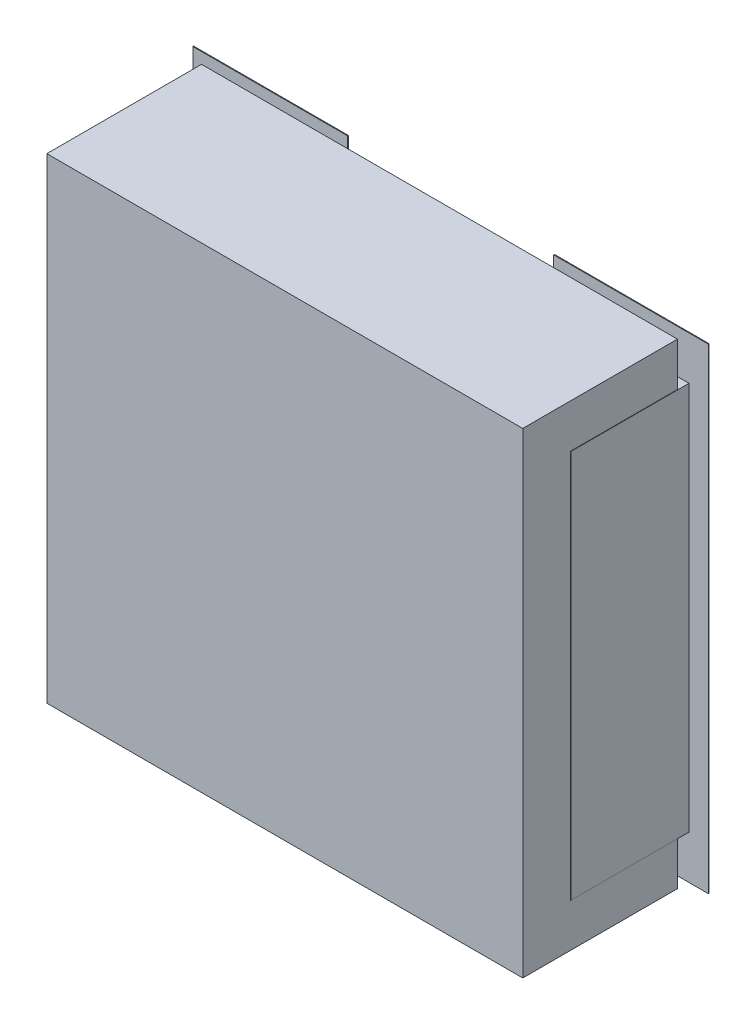
ISO-10303-21;
HEADER;
FILE_DESCRIPTION(('STEP AP214'),'2;1');
FILE_NAME('part.step','',(''),(''),'','','');
FILE_SCHEMA(('AUTOMOTIVE_DESIGN { 1 0 10303 214 1 1 1 1 }'));
ENDSEC;
DATA;
#1=APPLICATION_CONTEXT('core data for automotive mechanical design processes');
#2=APPLICATION_PROTOCOL_DEFINITION('international standard','automotive_design',2000,#1);
#3=PRODUCT_CONTEXT('',#1,'mechanical');
#4=PRODUCT('Part','Part','',(#3));
#5=PRODUCT_RELATED_PRODUCT_CATEGORY('part','',(#4));
#6=PRODUCT_DEFINITION_FORMATION('','',#4);
#7=PRODUCT_DEFINITION_CONTEXT('part definition',#1,'design');
#8=PRODUCT_DEFINITION('design','',#6,#7);
#9=PRODUCT_DEFINITION_SHAPE('','',#8);
#10=(LENGTH_UNIT() NAMED_UNIT(*) SI_UNIT(.MILLI.,.METRE.));
#11=(NAMED_UNIT(*) PLANE_ANGLE_UNIT() SI_UNIT($,.RADIAN.));
#12=(NAMED_UNIT(*) SI_UNIT($,.STERADIAN.) SOLID_ANGLE_UNIT());
#13=UNCERTAINTY_MEASURE_WITH_UNIT(LENGTH_MEASURE(1.E-05),#10,'distance_accuracy_value','');
#14=(GEOMETRIC_REPRESENTATION_CONTEXT(3) GLOBAL_UNCERTAINTY_ASSIGNED_CONTEXT((#13)) GLOBAL_UNIT_ASSIGNED_CONTEXT((#10,
#11,#12)) REPRESENTATION_CONTEXT('',''));
#15=CARTESIAN_POINT('',(0.,0.,0.));
#16=DIRECTION('',(0.,0.,1.));
#17=DIRECTION('',(1.,0.,0.));
#18=AXIS2_PLACEMENT_3D('',#15,#16,#17);
#19=CARTESIAN_POINT('',(0.,0.,0.0762));
#20=DIRECTION('',(0.,0.,1.));
#21=DIRECTION('',(1.,0.,0.));
#22=AXIS2_PLACEMENT_3D('',#19,#20,#21);
#23=PLANE('',#22);
#24=DIRECTION('',(0.,1.,0.));
#25=VECTOR('',#24,1.);
#26=CARTESIAN_POINT('',(1.3,3.,0.0762));
#27=LINE('',#26,#25);
#28=CARTESIAN_POINT('',(1.3,3.,0.0762));
#29=VERTEX_POINT('',#28);
#30=CARTESIAN_POINT('',(1.3,-3.,0.0762));
#31=VERTEX_POINT('',#30);
#32=EDGE_CURVE('E176',#29,#31,#27,.F.);
#33=ORIENTED_EDGE('',*,*,#32,.F.);
#34=DIRECTION('',(1.,0.,0.));
#35=VECTOR('',#34,1.);
#36=CARTESIAN_POINT('',(3.25,3.,0.0762));
#37=LINE('',#36,#35);
#38=CARTESIAN_POINT('',(3.25,3.,0.0762));
#39=VERTEX_POINT('',#38);
#40=EDGE_CURVE('E20',#39,#29,#37,.F.);
#41=ORIENTED_EDGE('',*,*,#40,.F.);
#42=DIRECTION('',(0.,1.,0.));
#43=VECTOR('',#42,1.);
#44=CARTESIAN_POINT('',(3.25,-3.,0.0762));
#45=LINE('',#44,#43);
#46=CARTESIAN_POINT('',(3.25,-3.,0.0762));
#47=VERTEX_POINT('',#46);
#48=EDGE_CURVE('E204',#47,#39,#45,.T.);
#49=ORIENTED_EDGE('',*,*,#48,.F.);
#50=DIRECTION('',(1.,0.,0.));
#51=VECTOR('',#50,1.);
#52=CARTESIAN_POINT('',(1.3,-3.,0.0762));
#53=LINE('',#52,#51);
#54=EDGE_CURVE('E189',#31,#47,#53,.T.);
#55=ORIENTED_EDGE('',*,*,#54,.F.);
#56=EDGE_LOOP('',(#33,#41,#49,#55));
#57=FACE_BOUND('',#56,.T.);
#58=ADVANCED_FACE('F17',(#57),#23,.F.);
#59=CARTESIAN_POINT('',(0.,0.,0.0762));
#60=DIRECTION('',(0.,0.,1.));
#61=DIRECTION('',(1.,0.,0.));
#62=AXIS2_PLACEMENT_3D('',#59,#60,#61);
#63=PLANE('',#62);
#64=DIRECTION('',(0.,1.,0.));
#65=VECTOR('',#64,1.);
#66=CARTESIAN_POINT('',(-1.3,-3.,0.0762));
#67=LINE('',#66,#65);
#68=CARTESIAN_POINT('',(-1.3,-3.,0.0762));
#69=VERTEX_POINT('',#68);
#70=CARTESIAN_POINT('',(-1.3,3.,0.0762));
#71=VERTEX_POINT('',#70);
#72=EDGE_CURVE('E211',#69,#71,#67,.T.);
#73=ORIENTED_EDGE('',*,*,#72,.F.);
#74=DIRECTION('',(1.,0.,0.));
#75=VECTOR('',#74,1.);
#76=CARTESIAN_POINT('',(-3.25,-3.,0.0762));
#77=LINE('',#76,#75);
#78=CARTESIAN_POINT('',(-3.25,-3.,0.0762));
#79=VERTEX_POINT('',#78);
#80=EDGE_CURVE('E206',#79,#69,#77,.T.);
#81=ORIENTED_EDGE('',*,*,#80,.F.);
#82=DIRECTION('',(0.,1.,0.));
#83=VECTOR('',#82,1.);
#84=CARTESIAN_POINT('',(-3.25,3.,0.0762));
#85=LINE('',#84,#83);
#86=CARTESIAN_POINT('',(-3.25,3.,0.0762));
#87=VERTEX_POINT('',#86);
#88=EDGE_CURVE('E224',#87,#79,#85,.F.);
#89=ORIENTED_EDGE('',*,*,#88,.F.);
#90=DIRECTION('',(1.,0.,0.));
#91=VECTOR('',#90,1.);
#92=CARTESIAN_POINT('',(-1.3,3.,0.0762));
#93=LINE('',#92,#91);
#94=EDGE_CURVE('E216',#71,#87,#93,.F.);
#95=ORIENTED_EDGE('',*,*,#94,.F.);
#96=EDGE_LOOP('',(#73,#81,#89,#95));
#97=FACE_BOUND('',#96,.T.);
#98=ADVANCED_FACE('F492',(#97),#63,.F.);
#99=CARTESIAN_POINT('',(3.25,3.,0.0762));
#100=DIRECTION('',(0.,1.,0.));
#101=DIRECTION('',(0.,0.,1.));
#102=AXIS2_PLACEMENT_3D('',#99,#100,#101);
#103=PLANE('',#102);
#104=DIRECTION('',(0.,0.,-1.));
#105=VECTOR('',#104,1.);
#106=CARTESIAN_POINT('',(3.25,3.,0.0762));
#107=LINE('',#106,#105);
#108=CARTESIAN_POINT('',(3.25,3.,0.0862));
#109=VERTEX_POINT('',#108);
#110=EDGE_CURVE('E185',#39,#109,#107,.F.);
#111=ORIENTED_EDGE('',*,*,#110,.F.);
#112=ORIENTED_EDGE('',*,*,#40,.T.);
#113=DIRECTION('',(0.,0.,1.));
#114=VECTOR('',#113,1.);
#115=CARTESIAN_POINT('',(1.3,3.,0.0762));
#116=LINE('',#115,#114);
#117=CARTESIAN_POINT('',(1.3,3.,0.0862));
#118=VERTEX_POINT('',#117);
#119=EDGE_CURVE('E182',#118,#29,#116,.F.);
#120=ORIENTED_EDGE('',*,*,#119,.F.);
#121=DIRECTION('',(1.,0.,0.));
#122=VECTOR('',#121,1.);
#123=CARTESIAN_POINT('',(0.,3.,0.0862));
#124=LINE('',#123,#122);
#125=EDGE_CURVE('E227',#109,#118,#124,.F.);
#126=ORIENTED_EDGE('',*,*,#125,.F.);
#127=EDGE_LOOP('',(#111,#112,#120,#126));
#128=FACE_BOUND('',#127,.T.);
#129=ADVANCED_FACE('F181',(#128),#103,.T.);
#130=CARTESIAN_POINT('',(1.3,3.,0.0762));
#131=DIRECTION('',(-1.,0.,0.));
#132=DIRECTION('',(0.,0.,1.));
#133=AXIS2_PLACEMENT_3D('',#130,#131,#132);
#134=PLANE('',#133);
#135=ORIENTED_EDGE('',*,*,#119,.T.);
#136=ORIENTED_EDGE('',*,*,#32,.T.);
#137=DIRECTION('',(0.,0.,-1.));
#138=VECTOR('',#137,1.);
#139=CARTESIAN_POINT('',(1.3,-3.,0.0762));
#140=LINE('',#139,#138);
#141=CARTESIAN_POINT('',(1.3,-3.,0.0862));
#142=VERTEX_POINT('',#141);
#143=EDGE_CURVE('E191',#142,#31,#140,.T.);
#144=ORIENTED_EDGE('',*,*,#143,.F.);
#145=DIRECTION('',(0.,1.,0.));
#146=VECTOR('',#145,1.);
#147=CARTESIAN_POINT('',(1.3,0.,0.0862));
#148=LINE('',#147,#146);
#149=EDGE_CURVE('E195',#118,#142,#148,.F.);
#150=ORIENTED_EDGE('',*,*,#149,.F.);
#151=EDGE_LOOP('',(#135,#136,#144,#150));
#152=FACE_BOUND('',#151,.T.);
#153=ADVANCED_FACE('F193',(#152),#134,.T.);
#154=CARTESIAN_POINT('',(1.3,-3.,0.0762));
#155=DIRECTION('',(0.,-1.,0.));
#156=DIRECTION('',(0.,0.,-1.));
#157=AXIS2_PLACEMENT_3D('',#154,#155,#156);
#158=PLANE('',#157);
#159=ORIENTED_EDGE('',*,*,#143,.T.);
#160=ORIENTED_EDGE('',*,*,#54,.T.);
#161=DIRECTION('',(0.,0.,-1.));
#162=VECTOR('',#161,1.);
#163=CARTESIAN_POINT('',(3.25,-3.,0.0762));
#164=LINE('',#163,#162);
#165=CARTESIAN_POINT('',(3.25,-3.,0.0862));
#166=VERTEX_POINT('',#165);
#167=EDGE_CURVE('E201',#166,#47,#164,.T.);
#168=ORIENTED_EDGE('',*,*,#167,.F.);
#169=DIRECTION('',(1.,0.,0.));
#170=VECTOR('',#169,1.);
#171=CARTESIAN_POINT('',(0.,-3.,0.0862));
#172=LINE('',#171,#170);
#173=EDGE_CURVE('E230',#142,#166,#172,.T.);
#174=ORIENTED_EDGE('',*,*,#173,.F.);
#175=EDGE_LOOP('',(#159,#160,#168,#174));
#176=FACE_BOUND('',#175,.T.);
#177=ADVANCED_FACE('F502',(#176),#158,.T.);
#178=CARTESIAN_POINT('',(3.25,-3.,0.0762));
#179=DIRECTION('',(1.,0.,0.));
#180=DIRECTION('',(0.,0.,-1.));
#181=AXIS2_PLACEMENT_3D('',#178,#179,#180);
#182=PLANE('',#181);
#183=ORIENTED_EDGE('',*,*,#167,.T.);
#184=ORIENTED_EDGE('',*,*,#48,.T.);
#185=ORIENTED_EDGE('',*,*,#110,.T.);
#186=DIRECTION('',(0.,1.,0.));
#187=VECTOR('',#186,1.);
#188=CARTESIAN_POINT('',(3.25,0.,0.0862));
#189=LINE('',#188,#187);
#190=EDGE_CURVE('E233',#166,#109,#189,.T.);
#191=ORIENTED_EDGE('',*,*,#190,.F.);
#192=EDGE_LOOP('',(#183,#184,#185,#191));
#193=FACE_BOUND('',#192,.T.);
#194=ADVANCED_FACE('F505',(#193),#182,.T.);
#195=CARTESIAN_POINT('',(-3.25,-3.,0.0762));
#196=DIRECTION('',(0.,-1.,0.));
#197=DIRECTION('',(0.,0.,-1.));
#198=AXIS2_PLACEMENT_3D('',#195,#196,#197);
#199=PLANE('',#198);
#200=DIRECTION('',(0.,0.,1.));
#201=VECTOR('',#200,1.);
#202=CARTESIAN_POINT('',(-3.25,-3.,0.0762));
#203=LINE('',#202,#201);
#204=CARTESIAN_POINT('',(-3.25,-3.,0.0862));
#205=VERTEX_POINT('',#204);
#206=EDGE_CURVE('E218',#79,#205,#203,.T.);
#207=ORIENTED_EDGE('',*,*,#206,.F.);
#208=ORIENTED_EDGE('',*,*,#80,.T.);
#209=DIRECTION('',(0.,0.,-1.));
#210=VECTOR('',#209,1.);
#211=CARTESIAN_POINT('',(-1.3,-3.,0.0762));
#212=LINE('',#211,#210);
#213=CARTESIAN_POINT('',(-1.3,-3.,0.0862));
#214=VERTEX_POINT('',#213);
#215=EDGE_CURVE('E208',#214,#69,#212,.T.);
#216=ORIENTED_EDGE('',*,*,#215,.F.);
#217=DIRECTION('',(1.,0.,0.));
#218=VECTOR('',#217,1.);
#219=CARTESIAN_POINT('',(0.,-3.,0.0862));
#220=LINE('',#219,#218);
#221=EDGE_CURVE('E240',#205,#214,#220,.T.);
#222=ORIENTED_EDGE('',*,*,#221,.F.);
#223=EDGE_LOOP('',(#207,#208,#216,#222));
#224=FACE_BOUND('',#223,.T.);
#225=ADVANCED_FACE('F487',(#224),#199,.T.);
#226=CARTESIAN_POINT('',(-1.3,-3.,0.0762));
#227=DIRECTION('',(1.,0.,0.));
#228=DIRECTION('',(0.,0.,-1.));
#229=AXIS2_PLACEMENT_3D('',#226,#227,#228);
#230=PLANE('',#229);
#231=ORIENTED_EDGE('',*,*,#215,.T.);
#232=ORIENTED_EDGE('',*,*,#72,.T.);
#233=DIRECTION('',(0.,0.,1.));
#234=VECTOR('',#233,1.);
#235=CARTESIAN_POINT('',(-1.3,3.,0.0762));
#236=LINE('',#235,#234);
#237=CARTESIAN_POINT('',(-1.3,3.,0.0862));
#238=VERTEX_POINT('',#237);
#239=EDGE_CURVE('E213',#238,#71,#236,.F.);
#240=ORIENTED_EDGE('',*,*,#239,.F.);
#241=DIRECTION('',(0.,1.,0.));
#242=VECTOR('',#241,1.);
#243=CARTESIAN_POINT('',(-1.3,0.,0.0862));
#244=LINE('',#243,#242);
#245=EDGE_CURVE('E243',#214,#238,#244,.T.);
#246=ORIENTED_EDGE('',*,*,#245,.F.);
#247=EDGE_LOOP('',(#231,#232,#240,#246));
#248=FACE_BOUND('',#247,.T.);
#249=ADVANCED_FACE('F490',(#248),#230,.T.);
#250=CARTESIAN_POINT('',(-1.3,3.,0.0762));
#251=DIRECTION('',(0.,1.,0.));
#252=DIRECTION('',(0.,0.,1.));
#253=AXIS2_PLACEMENT_3D('',#250,#251,#252);
#254=PLANE('',#253);
#255=ORIENTED_EDGE('',*,*,#239,.T.);
#256=ORIENTED_EDGE('',*,*,#94,.T.);
#257=DIRECTION('',(0.,0.,1.));
#258=VECTOR('',#257,1.);
#259=CARTESIAN_POINT('',(-3.25,3.,0.0762));
#260=LINE('',#259,#258);
#261=CARTESIAN_POINT('',(-3.25,3.,0.0862));
#262=VERTEX_POINT('',#261);
#263=EDGE_CURVE('E221',#262,#87,#260,.F.);
#264=ORIENTED_EDGE('',*,*,#263,.F.);
#265=DIRECTION('',(1.,0.,0.));
#266=VECTOR('',#265,1.);
#267=CARTESIAN_POINT('',(0.,3.,0.0862));
#268=LINE('',#267,#266);
#269=EDGE_CURVE('E246',#238,#262,#268,.F.);
#270=ORIENTED_EDGE('',*,*,#269,.F.);
#271=EDGE_LOOP('',(#255,#256,#264,#270));
#272=FACE_BOUND('',#271,.T.);
#273=ADVANCED_FACE('F480',(#272),#254,.T.);
#274=CARTESIAN_POINT('',(-3.25,3.,0.0762));
#275=DIRECTION('',(-1.,0.,0.));
#276=DIRECTION('',(0.,0.,1.));
#277=AXIS2_PLACEMENT_3D('',#274,#275,#276);
#278=PLANE('',#277);
#279=ORIENTED_EDGE('',*,*,#263,.T.);
#280=ORIENTED_EDGE('',*,*,#88,.T.);
#281=ORIENTED_EDGE('',*,*,#206,.T.);
#282=DIRECTION('',(0.,1.,0.));
#283=VECTOR('',#282,1.);
#284=CARTESIAN_POINT('',(-3.25,0.,0.0862));
#285=LINE('',#284,#283);
#286=EDGE_CURVE('E249',#262,#205,#285,.F.);
#287=ORIENTED_EDGE('',*,*,#286,.F.);
#288=EDGE_LOOP('',(#279,#280,#281,#287));
#289=FACE_BOUND('',#288,.T.);
#290=ADVANCED_FACE('F484',(#289),#278,.T.);
#291=CARTESIAN_POINT('',(0.,0.,0.0862));
#292=DIRECTION('',(0.,0.,1.));
#293=DIRECTION('',(1.,0.,0.));
#294=AXIS2_PLACEMENT_3D('',#291,#292,#293);
#295=PLANE('',#294);
#296=DIRECTION('',(0.,1.,0.));
#297=VECTOR('',#296,1.);
#298=CARTESIAN_POINT('',(1.455,2.45,0.0862));
#299=LINE('',#298,#297);
#300=CARTESIAN_POINT('',(1.455,2.45,0.0862));
#301=VERTEX_POINT('',#300);
#302=CARTESIAN_POINT('',(1.455,-2.45,0.0862));
#303=VERTEX_POINT('',#302);
#304=EDGE_CURVE('E260',#301,#303,#299,.F.);
#305=ORIENTED_EDGE('',*,*,#304,.F.);
#306=DIRECTION('',(1.,0.,0.));
#307=VECTOR('',#306,1.);
#308=CARTESIAN_POINT('',(0.,2.45,0.0862));
#309=LINE('',#308,#307);
#310=CARTESIAN_POINT('',(3.005,2.45,0.0862));
#311=VERTEX_POINT('',#310);
#312=EDGE_CURVE('E238',#301,#311,#309,.T.);
#313=ORIENTED_EDGE('',*,*,#312,.T.);
#314=DIRECTION('',(0.,1.,0.));
#315=VECTOR('',#314,1.);
#316=CARTESIAN_POINT('',(3.005,-2.45,0.0862));
#317=LINE('',#316,#315);
#318=CARTESIAN_POINT('',(3.005,-2.45,0.0862));
#319=VERTEX_POINT('',#318);
#320=EDGE_CURVE('E257',#319,#311,#317,.T.);
#321=ORIENTED_EDGE('',*,*,#320,.F.);
#322=DIRECTION('',(1.,0.,0.));
#323=VECTOR('',#322,1.);
#324=CARTESIAN_POINT('',(0.,-2.45,0.0862));
#325=LINE('',#324,#323);
#326=EDGE_CURVE('E236',#319,#303,#325,.F.);
#327=ORIENTED_EDGE('',*,*,#326,.T.);
#328=EDGE_LOOP('',(#305,#313,#321,#327));
#329=FACE_BOUND('',#328,.T.);
#330=ORIENTED_EDGE('',*,*,#173,.T.);
#331=ORIENTED_EDGE('',*,*,#190,.T.);
#332=ORIENTED_EDGE('',*,*,#125,.T.);
#333=ORIENTED_EDGE('',*,*,#149,.T.);
#334=EDGE_LOOP('',(#330,#331,#332,#333));
#335=FACE_BOUND('',#334,.T.);
#336=ADVANCED_FACE('F410',(#329,#335),#295,.T.);
#337=CARTESIAN_POINT('',(0.,0.,0.0862));
#338=DIRECTION('',(0.,0.,1.));
#339=DIRECTION('',(1.,0.,0.));
#340=AXIS2_PLACEMENT_3D('',#337,#338,#339);
#341=PLANE('',#340);
#342=DIRECTION('',(1.,0.,0.));
#343=VECTOR('',#342,1.);
#344=CARTESIAN_POINT('',(0.,-2.45,0.0862));
#345=LINE('',#344,#343);
#346=CARTESIAN_POINT('',(-1.455,-2.45,0.0862));
#347=VERTEX_POINT('',#346);
#348=CARTESIAN_POINT('',(-3.005,-2.45,0.0862));
#349=VERTEX_POINT('',#348);
#350=EDGE_CURVE('E255',#347,#349,#345,.F.);
#351=ORIENTED_EDGE('',*,*,#350,.T.);
#352=DIRECTION('',(0.,1.,0.));
#353=VECTOR('',#352,1.);
#354=CARTESIAN_POINT('',(-3.005,2.45,0.0862));
#355=LINE('',#354,#353);
#356=CARTESIAN_POINT('',(-3.005,2.45,0.0862));
#357=VERTEX_POINT('',#356);
#358=EDGE_CURVE('E271',#357,#349,#355,.F.);
#359=ORIENTED_EDGE('',*,*,#358,.F.);
#360=DIRECTION('',(1.,0.,0.));
#361=VECTOR('',#360,1.);
#362=CARTESIAN_POINT('',(0.,2.45,0.0862));
#363=LINE('',#362,#361);
#364=CARTESIAN_POINT('',(-1.455,2.45,0.0862));
#365=VERTEX_POINT('',#364);
#366=EDGE_CURVE('E252',#357,#365,#363,.T.);
#367=ORIENTED_EDGE('',*,*,#366,.T.);
#368=DIRECTION('',(0.,1.,0.));
#369=VECTOR('',#368,1.);
#370=CARTESIAN_POINT('',(-1.455,-2.45,0.0862));
#371=LINE('',#370,#369);
#372=EDGE_CURVE('E268',#347,#365,#371,.T.);
#373=ORIENTED_EDGE('',*,*,#372,.F.);
#374=EDGE_LOOP('',(#351,#359,#367,#373));
#375=FACE_BOUND('',#374,.T.);
#376=ORIENTED_EDGE('',*,*,#269,.T.);
#377=ORIENTED_EDGE('',*,*,#286,.T.);
#378=ORIENTED_EDGE('',*,*,#221,.T.);
#379=ORIENTED_EDGE('',*,*,#245,.T.);
#380=EDGE_LOOP('',(#376,#377,#378,#379));
#381=FACE_BOUND('',#380,.T.);
#382=ADVANCED_FACE('F415',(#375,#381),#341,.T.);
#383=CARTESIAN_POINT('',(3.005,-2.45,0.0762));
#384=DIRECTION('',(1.,0.,0.));
#385=DIRECTION('',(0.,0.,-1.));
#386=AXIS2_PLACEMENT_3D('',#383,#384,#385);
#387=PLANE('',#386);
#388=DIRECTION('',(0.,0.,-1.));
#389=VECTOR('',#388,1.);
#390=CARTESIAN_POINT('',(3.005,-2.45,0.0762));
#391=LINE('',#390,#389);
#392=CARTESIAN_POINT('',(3.005,-2.45,1.5762));
#393=VERTEX_POINT('',#392);
#394=EDGE_CURVE('E280',#319,#393,#391,.F.);
#395=ORIENTED_EDGE('',*,*,#394,.F.);
#396=ORIENTED_EDGE('',*,*,#320,.T.);
#397=DIRECTION('',(0.,0.,1.));
#398=VECTOR('',#397,1.);
#399=CARTESIAN_POINT('',(3.005,2.45,0.0762));
#400=LINE('',#399,#398);
#401=CARTESIAN_POINT('',(3.005,2.45,1.5762));
#402=VERTEX_POINT('',#401);
#403=EDGE_CURVE('E277',#402,#311,#400,.F.);
#404=ORIENTED_EDGE('',*,*,#403,.F.);
#405=DIRECTION('',(0.,1.,0.));
#406=VECTOR('',#405,1.);
#407=CARTESIAN_POINT('',(3.005,0.,1.5762));
#408=LINE('',#407,#406);
#409=EDGE_CURVE('E288',#393,#402,#408,.T.);
#410=ORIENTED_EDGE('',*,*,#409,.F.);
#411=EDGE_LOOP('',(#395,#396,#404,#410));
#412=FACE_BOUND('',#411,.T.);
#413=ADVANCED_FACE('F413',(#412),#387,.T.);
#414=CARTESIAN_POINT('',(1.455,2.45,0.0762));
#415=DIRECTION('',(-1.,0.,0.));
#416=DIRECTION('',(0.,0.,1.));
#417=AXIS2_PLACEMENT_3D('',#414,#415,#416);
#418=PLANE('',#417);
#419=DIRECTION('',(0.,0.,1.));
#420=VECTOR('',#419,1.);
#421=CARTESIAN_POINT('',(1.455,2.45,0.0762));
#422=LINE('',#421,#420);
#423=CARTESIAN_POINT('',(1.455,2.45,0.2262));
#424=VERTEX_POINT('',#423);
#425=EDGE_CURVE('E274',#301,#424,#422,.T.);
#426=ORIENTED_EDGE('',*,*,#425,.F.);
#427=ORIENTED_EDGE('',*,*,#304,.T.);
#428=DIRECTION('',(0.,0.,-1.));
#429=VECTOR('',#428,1.);
#430=CARTESIAN_POINT('',(1.455,-2.45,0.0762));
#431=LINE('',#430,#429);
#432=CARTESIAN_POINT('',(1.455,-2.45,0.2262));
#433=VERTEX_POINT('',#432);
#434=EDGE_CURVE('E282',#433,#303,#431,.T.);
#435=ORIENTED_EDGE('',*,*,#434,.F.);
#436=DIRECTION('',(0.,1.,0.));
#437=VECTOR('',#436,1.);
#438=CARTESIAN_POINT('',(1.455,0.,0.2262));
#439=LINE('',#438,#437);
#440=EDGE_CURVE('E294',#424,#433,#439,.F.);
#441=ORIENTED_EDGE('',*,*,#440,.F.);
#442=EDGE_LOOP('',(#426,#427,#435,#441));
#443=FACE_BOUND('',#442,.T.);
#444=ADVANCED_FACE('F407',(#443),#418,.T.);
#445=CARTESIAN_POINT('',(-1.455,-2.45,0.0762));
#446=DIRECTION('',(1.,0.,0.));
#447=DIRECTION('',(0.,0.,-1.));
#448=AXIS2_PLACEMENT_3D('',#445,#446,#447);
#449=PLANE('',#448);
#450=DIRECTION('',(0.,0.,-1.));
#451=VECTOR('',#450,1.);
#452=CARTESIAN_POINT('',(-1.455,-2.45,0.0762));
#453=LINE('',#452,#451);
#454=CARTESIAN_POINT('',(-1.455,-2.45,0.2262));
#455=VERTEX_POINT('',#454);
#456=EDGE_CURVE('E265',#455,#347,#453,.T.);
#457=ORIENTED_EDGE('',*,*,#456,.T.);
#458=ORIENTED_EDGE('',*,*,#372,.T.);
#459=DIRECTION('',(0.,0.,-1.));
#460=VECTOR('',#459,1.);
#461=CARTESIAN_POINT('',(-1.455,2.45,0.0762));
#462=LINE('',#461,#460);
#463=CARTESIAN_POINT('',(-1.455,2.45,0.2262));
#464=VERTEX_POINT('',#463);
#465=EDGE_CURVE('E263',#365,#464,#462,.F.);
#466=ORIENTED_EDGE('',*,*,#465,.T.);
#467=DIRECTION('',(0.,1.,0.));
#468=VECTOR('',#467,1.);
#469=CARTESIAN_POINT('',(-1.455,0.,0.2262));
#470=LINE('',#469,#468);
#471=EDGE_CURVE('E301',#455,#464,#470,.T.);
#472=ORIENTED_EDGE('',*,*,#471,.F.);
#473=EDGE_LOOP('',(#457,#458,#466,#472));
#474=FACE_BOUND('',#473,.T.);
#475=ADVANCED_FACE('F422',(#474),#449,.T.);
#476=CARTESIAN_POINT('',(-3.005,2.45,0.0762));
#477=DIRECTION('',(-1.,0.,0.));
#478=DIRECTION('',(0.,0.,1.));
#479=AXIS2_PLACEMENT_3D('',#476,#477,#478);
#480=PLANE('',#479);
#481=DIRECTION('',(0.,0.,1.));
#482=VECTOR('',#481,1.);
#483=CARTESIAN_POINT('',(-3.005,2.45,0.0762));
#484=LINE('',#483,#482);
#485=CARTESIAN_POINT('',(-3.005,2.45,1.5762));
#486=VERTEX_POINT('',#485);
#487=EDGE_CURVE('E315',#357,#486,#484,.T.);
#488=ORIENTED_EDGE('',*,*,#487,.F.);
#489=ORIENTED_EDGE('',*,*,#358,.T.);
#490=DIRECTION('',(0.,0.,-1.));
#491=VECTOR('',#490,1.);
#492=CARTESIAN_POINT('',(-3.005,-2.45,0.0762));
#493=LINE('',#492,#491);
#494=CARTESIAN_POINT('',(-3.005,-2.45,1.5762));
#495=VERTEX_POINT('',#494);
#496=EDGE_CURVE('E312',#495,#349,#493,.T.);
#497=ORIENTED_EDGE('',*,*,#496,.F.);
#498=DIRECTION('',(0.,1.,0.));
#499=VECTOR('',#498,1.);
#500=CARTESIAN_POINT('',(-3.005,0.,1.5762));
#501=LINE('',#500,#499);
#502=EDGE_CURVE('E323',#486,#495,#501,.F.);
#503=ORIENTED_EDGE('',*,*,#502,.F.);
#504=EDGE_LOOP('',(#488,#489,#497,#503));
#505=FACE_BOUND('',#504,.T.);
#506=ADVANCED_FACE('F459',(#505),#480,.T.);
#507=CARTESIAN_POINT('',(3.005,2.45,0.0762));
#508=DIRECTION('',(0.,1.,0.));
#509=DIRECTION('',(0.,0.,1.));
#510=AXIS2_PLACEMENT_3D('',#507,#508,#509);
#511=PLANE('',#510);
#512=ORIENTED_EDGE('',*,*,#403,.T.);
#513=ORIENTED_EDGE('',*,*,#312,.F.);
#514=ORIENTED_EDGE('',*,*,#425,.T.);
#515=DIRECTION('',(-1.,0.,0.));
#516=VECTOR('',#515,1.);
#517=CARTESIAN_POINT('',(0.,2.45,0.2262));
#518=LINE('',#517,#516);
#519=CARTESIAN_POINT('',(3.,2.45,0.2262));
#520=VERTEX_POINT('',#519);
#521=EDGE_CURVE('E306',#520,#424,#518,.T.);
#522=ORIENTED_EDGE('',*,*,#521,.F.);
#523=DIRECTION('',(0.,0.,-1.));
#524=VECTOR('',#523,1.);
#525=CARTESIAN_POINT('',(3.,2.45,0.0762));
#526=LINE('',#525,#524);
#527=CARTESIAN_POINT('',(3.,2.45,1.5762));
#528=VERTEX_POINT('',#527);
#529=EDGE_CURVE('E331',#528,#520,#526,.T.);
#530=ORIENTED_EDGE('',*,*,#529,.F.);
#531=DIRECTION('',(1.,0.,0.));
#532=VECTOR('',#531,1.);
#533=CARTESIAN_POINT('',(0.,2.45,1.5762));
#534=LINE('',#533,#532);
#535=EDGE_CURVE('E291',#402,#528,#534,.F.);
#536=ORIENTED_EDGE('',*,*,#535,.F.);
#537=EDGE_LOOP('',(#512,#513,#514,#522,#530,#536));
#538=FACE_BOUND('',#537,.T.);
#539=ADVANCED_FACE('F403',(#538),#511,.T.);
#540=CARTESIAN_POINT('',(1.455,-2.45,0.0762));
#541=DIRECTION('',(0.,-1.,0.));
#542=DIRECTION('',(0.,0.,-1.));
#543=AXIS2_PLACEMENT_3D('',#540,#541,#542);
#544=PLANE('',#543);
#545=ORIENTED_EDGE('',*,*,#434,.T.);
#546=ORIENTED_EDGE('',*,*,#326,.F.);
#547=ORIENTED_EDGE('',*,*,#394,.T.);
#548=DIRECTION('',(1.,0.,0.));
#549=VECTOR('',#548,1.);
#550=CARTESIAN_POINT('',(0.,-2.45,1.5762));
#551=LINE('',#550,#549);
#552=CARTESIAN_POINT('',(3.,-2.45,1.5762));
#553=VERTEX_POINT('',#552);
#554=EDGE_CURVE('E285',#553,#393,#551,.T.);
#555=ORIENTED_EDGE('',*,*,#554,.F.);
#556=DIRECTION('',(0.,0.,-1.));
#557=VECTOR('',#556,1.);
#558=CARTESIAN_POINT('',(3.,-2.45,0.0762));
#559=LINE('',#558,#557);
#560=CARTESIAN_POINT('',(3.,-2.45,0.2262));
#561=VERTEX_POINT('',#560);
#562=EDGE_CURVE('E342',#561,#553,#559,.F.);
#563=ORIENTED_EDGE('',*,*,#562,.F.);
#564=DIRECTION('',(-1.,0.,0.));
#565=VECTOR('',#564,1.);
#566=CARTESIAN_POINT('',(0.,-2.45,0.2262));
#567=LINE('',#566,#565);
#568=EDGE_CURVE('E297',#433,#561,#567,.F.);
#569=ORIENTED_EDGE('',*,*,#568,.F.);
#570=EDGE_LOOP('',(#545,#546,#547,#555,#563,#569));
#571=FACE_BOUND('',#570,.T.);
#572=ADVANCED_FACE('F395',(#571),#544,.T.);
#573=CARTESIAN_POINT('',(0.,0.,1.5762));
#574=DIRECTION('',(0.,0.,1.));
#575=DIRECTION('',(1.,0.,0.));
#576=AXIS2_PLACEMENT_3D('',#573,#574,#575);
#577=PLANE('',#576);
#578=ORIENTED_EDGE('',*,*,#535,.T.);
#579=DIRECTION('',(0.,1.,0.));
#580=VECTOR('',#579,1.);
#581=CARTESIAN_POINT('',(3.,-3.,1.5762));
#582=LINE('',#581,#580);
#583=EDGE_CURVE('E345',#553,#528,#582,.T.);
#584=ORIENTED_EDGE('',*,*,#583,.F.);
#585=ORIENTED_EDGE('',*,*,#554,.T.);
#586=ORIENTED_EDGE('',*,*,#409,.T.);
#587=EDGE_LOOP('',(#578,#584,#585,#586));
#588=FACE_BOUND('',#587,.T.);
#589=ADVANCED_FACE('F400',(#588),#577,.T.);
#590=CARTESIAN_POINT('',(0.,0.,0.2262));
#591=DIRECTION('',(0.,0.,-1.));
#592=DIRECTION('',(-1.,0.,0.));
#593=AXIS2_PLACEMENT_3D('',#590,#591,#592);
#594=PLANE('',#593);
#595=DIRECTION('',(0.,1.,0.));
#596=VECTOR('',#595,1.);
#597=CARTESIAN_POINT('',(3.,-3.,0.2262));
#598=LINE('',#597,#596);
#599=CARTESIAN_POINT('',(3.,3.,0.2262));
#600=VERTEX_POINT('',#599);
#601=EDGE_CURVE('E334',#520,#600,#598,.T.);
#602=ORIENTED_EDGE('',*,*,#601,.F.);
#603=ORIENTED_EDGE('',*,*,#521,.T.);
#604=ORIENTED_EDGE('',*,*,#440,.T.);
#605=ORIENTED_EDGE('',*,*,#568,.T.);
#606=DIRECTION('',(0.,1.,0.));
#607=VECTOR('',#606,1.);
#608=CARTESIAN_POINT('',(3.,-3.,0.2262));
#609=LINE('',#608,#607);
#610=CARTESIAN_POINT('',(3.,-3.,0.2262));
#611=VERTEX_POINT('',#610);
#612=EDGE_CURVE('E339',#611,#561,#609,.T.);
#613=ORIENTED_EDGE('',*,*,#612,.F.);
#614=DIRECTION('',(1.,0.,0.));
#615=VECTOR('',#614,1.);
#616=CARTESIAN_POINT('',(-3.,-3.,0.2262));
#617=LINE('',#616,#615);
#618=CARTESIAN_POINT('',(-3.,-3.,0.2262));
#619=VERTEX_POINT('',#618);
#620=EDGE_CURVE('E329',#619,#611,#617,.T.);
#621=ORIENTED_EDGE('',*,*,#620,.F.);
#622=DIRECTION('',(0.,1.,0.));
#623=VECTOR('',#622,1.);
#624=CARTESIAN_POINT('',(-3.,0.,0.2262));
#625=LINE('',#624,#623);
#626=CARTESIAN_POINT('',(-3.,-2.45,0.2262));
#627=VERTEX_POINT('',#626);
#628=EDGE_CURVE('E299',#619,#627,#625,.T.);
#629=ORIENTED_EDGE('',*,*,#628,.T.);
#630=DIRECTION('',(1.,0.,0.));
#631=VECTOR('',#630,1.);
#632=CARTESIAN_POINT('',(-3.005,-2.45,0.2262));
#633=LINE('',#632,#631);
#634=EDGE_CURVE('E309',#455,#627,#633,.F.);
#635=ORIENTED_EDGE('',*,*,#634,.F.);
#636=ORIENTED_EDGE('',*,*,#471,.T.);
#637=DIRECTION('',(1.,0.,0.));
#638=VECTOR('',#637,1.);
#639=CARTESIAN_POINT('',(-1.455,2.45,0.2262));
#640=LINE('',#639,#638);
#641=CARTESIAN_POINT('',(-3.,2.45,0.2262));
#642=VERTEX_POINT('',#641);
#643=EDGE_CURVE('E317',#642,#464,#640,.T.);
#644=ORIENTED_EDGE('',*,*,#643,.F.);
#645=DIRECTION('',(0.,1.,0.));
#646=VECTOR('',#645,1.);
#647=CARTESIAN_POINT('',(-3.,0.,0.2262));
#648=LINE('',#647,#646);
#649=CARTESIAN_POINT('',(-3.,3.,0.2262));
#650=VERTEX_POINT('',#649);
#651=EDGE_CURVE('E304',#642,#650,#648,.T.);
#652=ORIENTED_EDGE('',*,*,#651,.T.);
#653=DIRECTION('',(1.,0.,0.));
#654=VECTOR('',#653,1.);
#655=CARTESIAN_POINT('',(3.,3.,0.2262));
#656=LINE('',#655,#654);
#657=EDGE_CURVE('E351',#600,#650,#656,.F.);
#658=ORIENTED_EDGE('',*,*,#657,.F.);
#659=EDGE_LOOP('',(#602,#603,#604,#605,#613,#621,#629,#635,#636,#644,#652,#658));
#660=FACE_BOUND('',#659,.T.);
#661=ADVANCED_FACE('F382',(#660),#594,.T.);
#662=CARTESIAN_POINT('',(-3.005,-2.45,0.0762));
#663=DIRECTION('',(0.,-1.,0.));
#664=DIRECTION('',(0.,0.,-1.));
#665=AXIS2_PLACEMENT_3D('',#662,#663,#664);
#666=PLANE('',#665);
#667=ORIENTED_EDGE('',*,*,#496,.T.);
#668=ORIENTED_EDGE('',*,*,#350,.F.);
#669=ORIENTED_EDGE('',*,*,#456,.F.);
#670=ORIENTED_EDGE('',*,*,#634,.T.);
#671=DIRECTION('',(0.,0.,1.));
#672=VECTOR('',#671,1.);
#673=CARTESIAN_POINT('',(-3.,-2.45,0.0762));
#674=LINE('',#673,#672);
#675=CARTESIAN_POINT('',(-3.,-2.45,1.5762));
#676=VERTEX_POINT('',#675);
#677=EDGE_CURVE('E353',#676,#627,#674,.F.);
#678=ORIENTED_EDGE('',*,*,#677,.F.);
#679=DIRECTION('',(1.,0.,0.));
#680=VECTOR('',#679,1.);
#681=CARTESIAN_POINT('',(0.,-2.45,1.5762));
#682=LINE('',#681,#680);
#683=EDGE_CURVE('E326',#495,#676,#682,.T.);
#684=ORIENTED_EDGE('',*,*,#683,.F.);
#685=EDGE_LOOP('',(#667,#668,#669,#670,#678,#684));
#686=FACE_BOUND('',#685,.T.);
#687=ADVANCED_FACE('F446',(#686),#666,.T.);
#688=CARTESIAN_POINT('',(-1.455,2.45,0.0762));
#689=DIRECTION('',(0.,1.,0.));
#690=DIRECTION('',(0.,0.,1.));
#691=AXIS2_PLACEMENT_3D('',#688,#689,#690);
#692=PLANE('',#691);
#693=ORIENTED_EDGE('',*,*,#465,.F.);
#694=ORIENTED_EDGE('',*,*,#366,.F.);
#695=ORIENTED_EDGE('',*,*,#487,.T.);
#696=DIRECTION('',(1.,0.,0.));
#697=VECTOR('',#696,1.);
#698=CARTESIAN_POINT('',(0.,2.45,1.5762));
#699=LINE('',#698,#697);
#700=CARTESIAN_POINT('',(-3.,2.45,1.5762));
#701=VERTEX_POINT('',#700);
#702=EDGE_CURVE('E320',#701,#486,#699,.F.);
#703=ORIENTED_EDGE('',*,*,#702,.F.);
#704=DIRECTION('',(0.,0.,1.));
#705=VECTOR('',#704,1.);
#706=CARTESIAN_POINT('',(-3.,2.45,0.0762));
#707=LINE('',#706,#705);
#708=EDGE_CURVE('E360',#642,#701,#707,.T.);
#709=ORIENTED_EDGE('',*,*,#708,.F.);
#710=ORIENTED_EDGE('',*,*,#643,.T.);
#711=EDGE_LOOP('',(#693,#694,#695,#703,#709,#710));
#712=FACE_BOUND('',#711,.T.);
#713=ADVANCED_FACE('F442',(#712),#692,.T.);
#714=CARTESIAN_POINT('',(0.,0.,1.5762));
#715=DIRECTION('',(0.,0.,1.));
#716=DIRECTION('',(1.,0.,0.));
#717=AXIS2_PLACEMENT_3D('',#714,#715,#716);
#718=PLANE('',#717);
#719=ORIENTED_EDGE('',*,*,#683,.T.);
#720=DIRECTION('',(0.,1.,0.));
#721=VECTOR('',#720,1.);
#722=CARTESIAN_POINT('',(-3.,3.,1.5762));
#723=LINE('',#722,#721);
#724=EDGE_CURVE('E363',#701,#676,#723,.F.);
#725=ORIENTED_EDGE('',*,*,#724,.F.);
#726=ORIENTED_EDGE('',*,*,#702,.T.);
#727=ORIENTED_EDGE('',*,*,#502,.T.);
#728=EDGE_LOOP('',(#719,#725,#726,#727));
#729=FACE_BOUND('',#728,.T.);
#730=ADVANCED_FACE('F439',(#729),#718,.T.);
#731=CARTESIAN_POINT('',(-3.,-3.,0.0762));
#732=DIRECTION('',(0.,-1.,0.));
#733=DIRECTION('',(0.,0.,-1.));
#734=AXIS2_PLACEMENT_3D('',#731,#732,#733);
#735=PLANE('',#734);
#736=DIRECTION('',(0.,0.,1.));
#737=VECTOR('',#736,1.);
#738=CARTESIAN_POINT('',(-3.,-3.,0.0762));
#739=LINE('',#738,#737);
#740=CARTESIAN_POINT('',(-3.,-3.,2.1762));
#741=VERTEX_POINT('',#740);
#742=EDGE_CURVE('E356',#619,#741,#739,.T.);
#743=ORIENTED_EDGE('',*,*,#742,.F.);
#744=ORIENTED_EDGE('',*,*,#620,.T.);
#745=DIRECTION('',(0.,0.,-1.));
#746=VECTOR('',#745,1.);
#747=CARTESIAN_POINT('',(3.,-3.,0.0762));
#748=LINE('',#747,#746);
#749=CARTESIAN_POINT('',(3.,-3.,2.1762));
#750=VERTEX_POINT('',#749);
#751=EDGE_CURVE('E336',#750,#611,#748,.T.);
#752=ORIENTED_EDGE('',*,*,#751,.F.);
#753=DIRECTION('',(1.,0.,0.));
#754=VECTOR('',#753,1.);
#755=CARTESIAN_POINT('',(0.,-3.,2.1762));
#756=LINE('',#755,#754);
#757=EDGE_CURVE('E366',#741,#750,#756,.T.);
#758=ORIENTED_EDGE('',*,*,#757,.F.);
#759=EDGE_LOOP('',(#743,#744,#752,#758));
#760=FACE_BOUND('',#759,.T.);
#761=ADVANCED_FACE('F390',(#760),#735,.T.);
#762=CARTESIAN_POINT('',(3.,-3.,0.0762));
#763=DIRECTION('',(1.,0.,0.));
#764=DIRECTION('',(0.,0.,-1.));
#765=AXIS2_PLACEMENT_3D('',#762,#763,#764);
#766=PLANE('',#765);
#767=ORIENTED_EDGE('',*,*,#562,.T.);
#768=ORIENTED_EDGE('',*,*,#583,.T.);
#769=ORIENTED_EDGE('',*,*,#529,.T.);
#770=ORIENTED_EDGE('',*,*,#601,.T.);
#771=DIRECTION('',(0.,0.,1.));
#772=VECTOR('',#771,1.);
#773=CARTESIAN_POINT('',(3.,3.,0.0762));
#774=LINE('',#773,#772);
#775=CARTESIAN_POINT('',(3.,3.,2.1762));
#776=VERTEX_POINT('',#775);
#777=EDGE_CURVE('E348',#776,#600,#774,.F.);
#778=ORIENTED_EDGE('',*,*,#777,.F.);
#779=DIRECTION('',(0.,1.,0.));
#780=VECTOR('',#779,1.);
#781=CARTESIAN_POINT('',(3.,0.,2.1762));
#782=LINE('',#781,#780);
#783=EDGE_CURVE('E369',#750,#776,#782,.T.);
#784=ORIENTED_EDGE('',*,*,#783,.F.);
#785=ORIENTED_EDGE('',*,*,#751,.T.);
#786=ORIENTED_EDGE('',*,*,#612,.T.);
#787=EDGE_LOOP('',(#767,#768,#769,#770,#778,#784,#785,#786));
#788=FACE_BOUND('',#787,.T.);
#789=ADVANCED_FACE('F379',(#788),#766,.T.);
#790=CARTESIAN_POINT('',(3.,3.,0.0762));
#791=DIRECTION('',(0.,1.,0.));
#792=DIRECTION('',(0.,0.,1.));
#793=AXIS2_PLACEMENT_3D('',#790,#791,#792);
#794=PLANE('',#793);
#795=ORIENTED_EDGE('',*,*,#777,.T.);
#796=ORIENTED_EDGE('',*,*,#657,.T.);
#797=DIRECTION('',(0.,0.,1.));
#798=VECTOR('',#797,1.);
#799=CARTESIAN_POINT('',(-3.,3.,0.0762));
#800=LINE('',#799,#798);
#801=CARTESIAN_POINT('',(-3.,3.,2.1762));
#802=VERTEX_POINT('',#801);
#803=EDGE_CURVE('E35',#802,#650,#800,.F.);
#804=ORIENTED_EDGE('',*,*,#803,.F.);
#805=DIRECTION('',(1.,0.,0.));
#806=VECTOR('',#805,1.);
#807=CARTESIAN_POINT('',(0.,3.,2.1762));
#808=LINE('',#807,#806);
#809=EDGE_CURVE('E26',#776,#802,#808,.F.);
#810=ORIENTED_EDGE('',*,*,#809,.F.);
#811=EDGE_LOOP('',(#795,#796,#804,#810));
#812=FACE_BOUND('',#811,.T.);
#813=ADVANCED_FACE('F376',(#812),#794,.T.);
#814=CARTESIAN_POINT('',(-3.,3.,0.0762));
#815=DIRECTION('',(-1.,0.,0.));
#816=DIRECTION('',(0.,0.,1.));
#817=AXIS2_PLACEMENT_3D('',#814,#815,#816);
#818=PLANE('',#817);
#819=ORIENTED_EDGE('',*,*,#708,.T.);
#820=ORIENTED_EDGE('',*,*,#724,.T.);
#821=ORIENTED_EDGE('',*,*,#677,.T.);
#822=ORIENTED_EDGE('',*,*,#628,.F.);
#823=ORIENTED_EDGE('',*,*,#742,.T.);
#824=DIRECTION('',(0.,1.,0.));
#825=VECTOR('',#824,1.);
#826=CARTESIAN_POINT('',(-3.,0.,2.1762));
#827=LINE('',#826,#825);
#828=EDGE_CURVE('E11',#802,#741,#827,.F.);
#829=ORIENTED_EDGE('',*,*,#828,.F.);
#830=ORIENTED_EDGE('',*,*,#803,.T.);
#831=ORIENTED_EDGE('',*,*,#651,.F.);
#832=EDGE_LOOP('',(#819,#820,#821,#822,#823,#829,#830,#831));
#833=FACE_BOUND('',#832,.T.);
#834=ADVANCED_FACE('F386',(#833),#818,.T.);
#835=CARTESIAN_POINT('',(0.,0.,2.1762));
#836=DIRECTION('',(0.,0.,1.));
#837=DIRECTION('',(1.,0.,0.));
#838=AXIS2_PLACEMENT_3D('',#835,#836,#837);
#839=PLANE('',#838);
#840=ORIENTED_EDGE('',*,*,#809,.T.);
#841=ORIENTED_EDGE('',*,*,#828,.T.);
#842=ORIENTED_EDGE('',*,*,#757,.T.);
#843=ORIENTED_EDGE('',*,*,#783,.T.);
#844=EDGE_LOOP('',(#840,#841,#842,#843));
#845=FACE_BOUND('',#844,.T.);
#846=ADVANCED_FACE('F374',(#845),#839,.T.);
#847=CLOSED_SHELL('',(#58,#98,#129,#153,#177,#194,#225,#249,#273,#290,#336,#382,#413,#444,#475,
#506,#539,#572,#589,#661,#687,#713,#730,#761,#789,#813,#834,#846));
#848=MANIFOLD_SOLID_BREP('B1',#847);
#849=ADVANCED_BREP_SHAPE_REPRESENTATION('',(#18,#848),#14);
#850=SHAPE_DEFINITION_REPRESENTATION(#9,#849);
ENDSEC;
END-ISO-10303-21;
